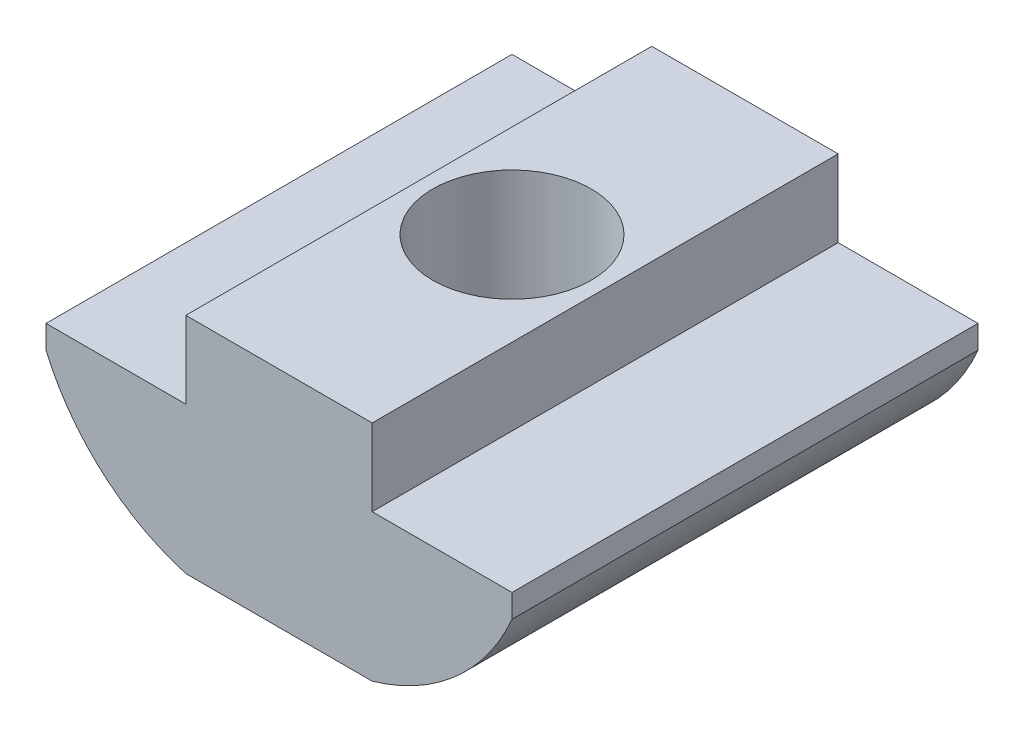
ISO-10303-21;
HEADER;
FILE_DESCRIPTION(('STEP AP214'),'2;1');
FILE_NAME('part.step','',(''),(''),'','','');
FILE_SCHEMA(('AUTOMOTIVE_DESIGN { 1 0 10303 214 1 1 1 1 }'));
ENDSEC;
DATA;
#1=APPLICATION_CONTEXT('core data for automotive mechanical design processes');
#2=APPLICATION_PROTOCOL_DEFINITION('international standard','automotive_design',2000,#1);
#3=PRODUCT_CONTEXT('',#1,'mechanical');
#4=PRODUCT('Part','Part','',(#3));
#5=PRODUCT_RELATED_PRODUCT_CATEGORY('part','',(#4));
#6=PRODUCT_DEFINITION_FORMATION('','',#4);
#7=PRODUCT_DEFINITION_CONTEXT('part definition',#1,'design');
#8=PRODUCT_DEFINITION('design','',#6,#7);
#9=PRODUCT_DEFINITION_SHAPE('','',#8);
#10=(LENGTH_UNIT() NAMED_UNIT(*) SI_UNIT(.MILLI.,.METRE.));
#11=(NAMED_UNIT(*) PLANE_ANGLE_UNIT() SI_UNIT($,.RADIAN.));
#12=(NAMED_UNIT(*) SI_UNIT($,.STERADIAN.) SOLID_ANGLE_UNIT());
#13=UNCERTAINTY_MEASURE_WITH_UNIT(LENGTH_MEASURE(1.E-05),#10,'distance_accuracy_value','');
#14=(GEOMETRIC_REPRESENTATION_CONTEXT(3) GLOBAL_UNCERTAINTY_ASSIGNED_CONTEXT((#13)) GLOBAL_UNIT_ASSIGNED_CONTEXT((#10,
#11,#12)) REPRESENTATION_CONTEXT('',''));
#15=CARTESIAN_POINT('',(0.,0.,0.));
#16=DIRECTION('',(0.,0.,1.));
#17=DIRECTION('',(1.,0.,0.));
#18=AXIS2_PLACEMENT_3D('',#15,#16,#17);
#19=CARTESIAN_POINT('',(1.37523414087264,-0.582340536837478,10.));
#20=DIRECTION('',(0.,0.,-1.));
#21=DIRECTION('',(-1.,0.,0.));
#22=AXIS2_PLACEMENT_3D('',#19,#20,#21);
#23=CYLINDRICAL_SURFACE('',#22,9.39188894785355);
#24=CARTESIAN_POINT('',(1.37523414087264,-0.582340536837478,-10.));
#25=DIRECTION('',(0.,0.,1.));
#26=DIRECTION('',(1.,0.,0.));
#27=AXIS2_PLACEMENT_3D('',#24,#25,#26);
#28=CIRCLE('',#27,9.39188894785355);
#29=CARTESIAN_POINT('',(4.00000000000091,-9.60000000000014,-10.));
#30=VERTEX_POINT('',#29);
#31=CARTESIAN_POINT('',(10.0000000000005,-4.2999999999995,-10.));
#32=VERTEX_POINT('',#31);
#33=EDGE_CURVE('E146',#30,#32,#28,.T.);
#34=ORIENTED_EDGE('',*,*,#33,.T.);
#35=DIRECTION('',(0.,0.,-1.));
#36=VECTOR('',#35,1.);
#37=CARTESIAN_POINT('',(10.0000000000005,-4.2999999999995,10.));
#38=LINE('',#37,#36);
#39=CARTESIAN_POINT('',(10.0000000000005,-4.2999999999995,10.));
#40=VERTEX_POINT('',#39);
#41=EDGE_CURVE('E11',#40,#32,#38,.T.);
#42=ORIENTED_EDGE('',*,*,#41,.F.);
#43=CARTESIAN_POINT('',(1.37523414087264,-0.582340536837478,10.));
#44=DIRECTION('',(0.,0.,1.));
#45=DIRECTION('',(1.,0.,0.));
#46=AXIS2_PLACEMENT_3D('',#43,#44,#45);
#47=CIRCLE('',#46,9.39188894785355);
#48=CARTESIAN_POINT('',(4.00000000000091,-9.60000000000014,10.));
#49=VERTEX_POINT('',#48);
#50=EDGE_CURVE('E165',#49,#40,#47,.T.);
#51=ORIENTED_EDGE('',*,*,#50,.F.);
#52=DIRECTION('',(0.,0.,-1.));
#53=VECTOR('',#52,1.);
#54=CARTESIAN_POINT('',(4.00000000000091,-9.60000000000014,10.));
#55=LINE('',#54,#53);
#56=EDGE_CURVE('E142',#49,#30,#55,.T.);
#57=ORIENTED_EDGE('',*,*,#56,.T.);
#58=EDGE_LOOP('',(#34,#42,#51,#57));
#59=FACE_BOUND('',#58,.T.);
#60=ADVANCED_FACE('F38',(#59),#23,.T.);
#61=CARTESIAN_POINT('',(10.,-3.30000000000007,10.));
#62=DIRECTION('',(-1.,-4.54497550706182E-13,0.));
#63=DIRECTION('',(4.54497550706182E-13,-1.,0.));
#64=AXIS2_PLACEMENT_3D('',#61,#62,#63);
#65=PLANE('',#64);
#66=DIRECTION('',(-4.54497550706182E-13,1.,0.));
#67=VECTOR('',#66,1.);
#68=CARTESIAN_POINT('',(10.,-3.30000000000007,-10.));
#69=LINE('',#68,#67);
#70=CARTESIAN_POINT('',(10.,-3.30000000000007,-10.));
#71=VERTEX_POINT('',#70);
#72=EDGE_CURVE('E149',#32,#71,#69,.T.);
#73=ORIENTED_EDGE('',*,*,#72,.T.);
#74=DIRECTION('',(0.,0.,-1.));
#75=VECTOR('',#74,1.);
#76=CARTESIAN_POINT('',(10.,-3.30000000000007,10.));
#77=LINE('',#76,#75);
#78=CARTESIAN_POINT('',(10.,-3.30000000000007,10.));
#79=VERTEX_POINT('',#78);
#80=EDGE_CURVE('E46',#79,#71,#77,.T.);
#81=ORIENTED_EDGE('',*,*,#80,.F.);
#82=DIRECTION('',(-4.54497550706182E-13,1.,0.));
#83=VECTOR('',#82,1.);
#84=CARTESIAN_POINT('',(10.,-3.30000000000007,10.));
#85=LINE('',#84,#83);
#86=EDGE_CURVE('E103',#40,#79,#85,.T.);
#87=ORIENTED_EDGE('',*,*,#86,.F.);
#88=ORIENTED_EDGE('',*,*,#41,.T.);
#89=EDGE_LOOP('',(#73,#81,#87,#88));
#90=FACE_BOUND('',#89,.T.);
#91=ADVANCED_FACE('F233',(#90),#65,.F.);
#92=CARTESIAN_POINT('',(10.,-3.30000000000007,10.));
#93=DIRECTION('',(0.,-1.,0.));
#94=DIRECTION('',(0.,0.,-1.));
#95=AXIS2_PLACEMENT_3D('',#92,#93,#94);
#96=PLANE('',#95);
#97=DIRECTION('',(-1.,0.,0.));
#98=VECTOR('',#97,1.);
#99=CARTESIAN_POINT('',(10.,-3.30000000000007,-10.));
#100=LINE('',#99,#98);
#101=CARTESIAN_POINT('',(4.,-3.30000000000007,-10.));
#102=VERTEX_POINT('',#101);
#103=EDGE_CURVE('E152',#71,#102,#100,.T.);
#104=ORIENTED_EDGE('',*,*,#103,.T.);
#105=DIRECTION('',(0.,0.,-1.));
#106=VECTOR('',#105,1.);
#107=CARTESIAN_POINT('',(4.,-3.30000000000007,10.));
#108=LINE('',#107,#106);
#109=CARTESIAN_POINT('',(4.,-3.30000000000007,10.));
#110=VERTEX_POINT('',#109);
#111=EDGE_CURVE('E178',#110,#102,#108,.T.);
#112=ORIENTED_EDGE('',*,*,#111,.F.);
#113=DIRECTION('',(-1.,0.,0.));
#114=VECTOR('',#113,1.);
#115=CARTESIAN_POINT('',(10.,-3.30000000000007,10.));
#116=LINE('',#115,#114);
#117=EDGE_CURVE('E186',#79,#110,#116,.T.);
#118=ORIENTED_EDGE('',*,*,#117,.F.);
#119=ORIENTED_EDGE('',*,*,#80,.T.);
#120=EDGE_LOOP('',(#104,#112,#118,#119));
#121=FACE_BOUND('',#120,.T.);
#122=ADVANCED_FACE('F184',(#121),#96,.F.);
#123=CARTESIAN_POINT('',(4.,-3.30000000000007,10.));
#124=DIRECTION('',(-1.,0.,0.));
#125=DIRECTION('',(0.,0.,1.));
#126=AXIS2_PLACEMENT_3D('',#123,#124,#125);
#127=PLANE('',#126);
#128=DIRECTION('',(0.,1.,0.));
#129=VECTOR('',#128,1.);
#130=CARTESIAN_POINT('',(4.,-3.30000000000007,-10.));
#131=LINE('',#130,#129);
#132=CARTESIAN_POINT('',(4.,0.,-10.));
#133=VERTEX_POINT('',#132);
#134=EDGE_CURVE('E154',#102,#133,#131,.T.);
#135=ORIENTED_EDGE('',*,*,#134,.T.);
#136=DIRECTION('',(0.,0.,-1.));
#137=VECTOR('',#136,1.);
#138=CARTESIAN_POINT('',(4.,0.,10.));
#139=LINE('',#138,#137);
#140=CARTESIAN_POINT('',(4.,0.,10.));
#141=VERTEX_POINT('',#140);
#142=EDGE_CURVE('E175',#141,#133,#139,.T.);
#143=ORIENTED_EDGE('',*,*,#142,.F.);
#144=DIRECTION('',(0.,1.,0.));
#145=VECTOR('',#144,1.);
#146=CARTESIAN_POINT('',(4.,-3.30000000000007,10.));
#147=LINE('',#146,#145);
#148=EDGE_CURVE('E204',#110,#141,#147,.T.);
#149=ORIENTED_EDGE('',*,*,#148,.F.);
#150=ORIENTED_EDGE('',*,*,#111,.T.);
#151=EDGE_LOOP('',(#135,#143,#149,#150));
#152=FACE_BOUND('',#151,.T.);
#153=ADVANCED_FACE('F195',(#152),#127,.F.);
#154=CARTESIAN_POINT('',(4.,0.,10.));
#155=DIRECTION('',(0.,-1.,0.));
#156=DIRECTION('',(0.,0.,-1.));
#157=AXIS2_PLACEMENT_3D('',#154,#155,#156);
#158=PLANE('',#157);
#159=CARTESIAN_POINT('',(0.,0.,0.));
#160=DIRECTION('',(0.,1.,0.));
#161=DIRECTION('',(0.,0.,1.));
#162=AXIS2_PLACEMENT_3D('',#159,#160,#161);
#163=CIRCLE('',#162,3.39999999999999);
#164=CARTESIAN_POINT('',(0.,0.,3.39999999999999));
#165=VERTEX_POINT('',#164);
#166=EDGE_CURVE('E214',#165,#165,#163,.T.);
#167=ORIENTED_EDGE('',*,*,#166,.F.);
#168=EDGE_LOOP('',(#167));
#169=FACE_BOUND('',#168,.T.);
#170=DIRECTION('',(-1.,0.,0.));
#171=VECTOR('',#170,1.);
#172=CARTESIAN_POINT('',(4.,0.,-10.));
#173=LINE('',#172,#171);
#174=CARTESIAN_POINT('',(-4.,0.,-10.));
#175=VERTEX_POINT('',#174);
#176=EDGE_CURVE('E156',#133,#175,#173,.T.);
#177=ORIENTED_EDGE('',*,*,#176,.T.);
#178=DIRECTION('',(0.,0.,-1.));
#179=VECTOR('',#178,1.);
#180=CARTESIAN_POINT('',(-4.,0.,10.));
#181=LINE('',#180,#179);
#182=CARTESIAN_POINT('',(-4.,0.,10.));
#183=VERTEX_POINT('',#182);
#184=EDGE_CURVE('E172',#183,#175,#181,.T.);
#185=ORIENTED_EDGE('',*,*,#184,.F.);
#186=DIRECTION('',(-1.,0.,0.));
#187=VECTOR('',#186,1.);
#188=CARTESIAN_POINT('',(4.,0.,10.));
#189=LINE('',#188,#187);
#190=EDGE_CURVE('E201',#141,#183,#189,.T.);
#191=ORIENTED_EDGE('',*,*,#190,.F.);
#192=ORIENTED_EDGE('',*,*,#142,.T.);
#193=EDGE_LOOP('',(#177,#185,#191,#192));
#194=FACE_BOUND('',#193,.T.);
#195=ADVANCED_FACE('F199',(#169,#194),#158,.F.);
#196=CARTESIAN_POINT('',(-4.,-3.30000000000007,10.));
#197=DIRECTION('',(1.,0.,0.));
#198=DIRECTION('',(0.,0.,-1.));
#199=AXIS2_PLACEMENT_3D('',#196,#197,#198);
#200=PLANE('',#199);
#201=DIRECTION('',(0.,-1.,0.));
#202=VECTOR('',#201,1.);
#203=CARTESIAN_POINT('',(-4.,-3.30000000000007,-10.));
#204=LINE('',#203,#202);
#205=CARTESIAN_POINT('',(-4.,-3.30000000000007,-10.));
#206=VERTEX_POINT('',#205);
#207=EDGE_CURVE('E158',#175,#206,#204,.T.);
#208=ORIENTED_EDGE('',*,*,#207,.T.);
#209=DIRECTION('',(0.,0.,-1.));
#210=VECTOR('',#209,1.);
#211=CARTESIAN_POINT('',(-4.,-3.30000000000007,10.));
#212=LINE('',#211,#210);
#213=CARTESIAN_POINT('',(-4.,-3.30000000000007,10.));
#214=VERTEX_POINT('',#213);
#215=EDGE_CURVE('E169',#214,#206,#212,.T.);
#216=ORIENTED_EDGE('',*,*,#215,.F.);
#217=DIRECTION('',(0.,-1.,0.));
#218=VECTOR('',#217,1.);
#219=CARTESIAN_POINT('',(-4.,-3.30000000000007,10.));
#220=LINE('',#219,#218);
#221=EDGE_CURVE('E203',#183,#214,#220,.T.);
#222=ORIENTED_EDGE('',*,*,#221,.F.);
#223=ORIENTED_EDGE('',*,*,#184,.T.);
#224=EDGE_LOOP('',(#208,#216,#222,#223));
#225=FACE_BOUND('',#224,.T.);
#226=ADVANCED_FACE('F222',(#225),#200,.F.);
#227=CARTESIAN_POINT('',(-4.,-3.30000000000007,10.));
#228=DIRECTION('',(0.,-1.,0.));
#229=DIRECTION('',(0.,0.,-1.));
#230=AXIS2_PLACEMENT_3D('',#227,#228,#229);
#231=PLANE('',#230);
#232=DIRECTION('',(-1.,0.,0.));
#233=VECTOR('',#232,1.);
#234=CARTESIAN_POINT('',(-4.,-3.30000000000007,-10.));
#235=LINE('',#234,#233);
#236=CARTESIAN_POINT('',(-10.,-3.30000000000007,-10.));
#237=VERTEX_POINT('',#236);
#238=EDGE_CURVE('E160',#206,#237,#235,.T.);
#239=ORIENTED_EDGE('',*,*,#238,.T.);
#240=DIRECTION('',(0.,0.,-1.));
#241=VECTOR('',#240,1.);
#242=CARTESIAN_POINT('',(-10.,-3.30000000000007,10.));
#243=LINE('',#242,#241);
#244=CARTESIAN_POINT('',(-10.,-3.30000000000007,10.));
#245=VERTEX_POINT('',#244);
#246=EDGE_CURVE('E137',#245,#237,#243,.T.);
#247=ORIENTED_EDGE('',*,*,#246,.F.);
#248=DIRECTION('',(-1.,0.,0.));
#249=VECTOR('',#248,1.);
#250=CARTESIAN_POINT('',(-4.,-3.30000000000007,10.));
#251=LINE('',#250,#249);
#252=EDGE_CURVE('E128',#214,#245,#251,.T.);
#253=ORIENTED_EDGE('',*,*,#252,.F.);
#254=ORIENTED_EDGE('',*,*,#215,.T.);
#255=EDGE_LOOP('',(#239,#247,#253,#254));
#256=FACE_BOUND('',#255,.T.);
#257=ADVANCED_FACE('F228',(#256),#231,.F.);
#258=CARTESIAN_POINT('',(-10.,-3.30000000000007,10.));
#259=DIRECTION('',(1.,0.,0.));
#260=DIRECTION('',(0.,0.,-1.));
#261=AXIS2_PLACEMENT_3D('',#258,#259,#260);
#262=PLANE('',#261);
#263=DIRECTION('',(0.,-1.,0.));
#264=VECTOR('',#263,1.);
#265=CARTESIAN_POINT('',(-10.,-3.30000000000007,-10.));
#266=LINE('',#265,#264);
#267=CARTESIAN_POINT('',(-10.,-4.30000000000019,-10.));
#268=VERTEX_POINT('',#267);
#269=EDGE_CURVE('E136',#237,#268,#266,.T.);
#270=ORIENTED_EDGE('',*,*,#269,.T.);
#271=DIRECTION('',(0.,0.,-1.));
#272=VECTOR('',#271,1.);
#273=CARTESIAN_POINT('',(-10.,-4.30000000000019,10.));
#274=LINE('',#273,#272);
#275=CARTESIAN_POINT('',(-10.,-4.30000000000019,10.));
#276=VERTEX_POINT('',#275);
#277=EDGE_CURVE('E133',#276,#268,#274,.T.);
#278=ORIENTED_EDGE('',*,*,#277,.F.);
#279=DIRECTION('',(0.,-1.,0.));
#280=VECTOR('',#279,1.);
#281=CARTESIAN_POINT('',(-10.,-3.30000000000007,10.));
#282=LINE('',#281,#280);
#283=EDGE_CURVE('E122',#245,#276,#282,.T.);
#284=ORIENTED_EDGE('',*,*,#283,.F.);
#285=ORIENTED_EDGE('',*,*,#246,.T.);
#286=EDGE_LOOP('',(#270,#278,#284,#285));
#287=FACE_BOUND('',#286,.T.);
#288=ADVANCED_FACE('F134',(#287),#262,.F.);
#289=CARTESIAN_POINT('',(-1.37523414087264,-0.582340536837478,10.));
#290=DIRECTION('',(0.,0.,-1.));
#291=DIRECTION('',(-1.,0.,0.));
#292=AXIS2_PLACEMENT_3D('',#289,#290,#291);
#293=CYLINDRICAL_SURFACE('',#292,9.39188894785349);
#294=CARTESIAN_POINT('',(-1.37523414087264,-0.582340536837478,-10.));
#295=DIRECTION('',(0.,0.,1.));
#296=DIRECTION('',(1.,0.,0.));
#297=AXIS2_PLACEMENT_3D('',#294,#295,#296);
#298=CIRCLE('',#297,9.39188894785349);
#299=CARTESIAN_POINT('',(-4.00000000000136,-9.60000000000002,-10.));
#300=VERTEX_POINT('',#299);
#301=EDGE_CURVE('E89',#268,#300,#298,.T.);
#302=ORIENTED_EDGE('',*,*,#301,.T.);
#303=DIRECTION('',(0.,0.,-1.));
#304=VECTOR('',#303,1.);
#305=CARTESIAN_POINT('',(-4.00000000000136,-9.60000000000002,10.));
#306=LINE('',#305,#304);
#307=CARTESIAN_POINT('',(-4.00000000000136,-9.60000000000002,10.));
#308=VERTEX_POINT('',#307);
#309=EDGE_CURVE('E138',#308,#300,#306,.T.);
#310=ORIENTED_EDGE('',*,*,#309,.F.);
#311=CARTESIAN_POINT('',(-1.37523414087264,-0.582340536837478,10.));
#312=DIRECTION('',(0.,0.,1.));
#313=DIRECTION('',(1.,0.,0.));
#314=AXIS2_PLACEMENT_3D('',#311,#312,#313);
#315=CIRCLE('',#314,9.39188894785349);
#316=EDGE_CURVE('E126',#276,#308,#315,.T.);
#317=ORIENTED_EDGE('',*,*,#316,.F.);
#318=ORIENTED_EDGE('',*,*,#277,.T.);
#319=EDGE_LOOP('',(#302,#310,#317,#318));
#320=FACE_BOUND('',#319,.T.);
#321=ADVANCED_FACE('F140',(#320),#293,.T.);
#322=CARTESIAN_POINT('',(4.00000000000091,-9.60000000000014,10.));
#323=DIRECTION('',(0.,1.,0.));
#324=DIRECTION('',(-1.,0.,0.));
#325=AXIS2_PLACEMENT_3D('',#322,#323,#324);
#326=PLANE('',#325);
#327=CARTESIAN_POINT('',(0.,-9.60000000000008,0.));
#328=DIRECTION('',(0.,1.,0.));
#329=DIRECTION('',(-1.,0.,0.));
#330=AXIS2_PLACEMENT_3D('',#327,#328,#329);
#331=CIRCLE('',#330,3.39999999999999);
#332=CARTESIAN_POINT('',(-3.39999999999999,-9.60000000000003,0.));
#333=VERTEX_POINT('',#332);
#334=EDGE_CURVE('E150',#333,#333,#331,.T.);
#335=ORIENTED_EDGE('',*,*,#334,.T.);
#336=EDGE_LOOP('',(#335));
#337=FACE_BOUND('',#336,.T.);
#338=DIRECTION('',(1.,0.,0.));
#339=VECTOR('',#338,1.);
#340=CARTESIAN_POINT('',(4.00000000000091,-9.60000000000014,-10.));
#341=LINE('',#340,#339);
#342=EDGE_CURVE('E95',#300,#30,#341,.T.);
#343=ORIENTED_EDGE('',*,*,#342,.T.);
#344=ORIENTED_EDGE('',*,*,#56,.F.);
#345=DIRECTION('',(1.,0.,0.));
#346=VECTOR('',#345,1.);
#347=CARTESIAN_POINT('',(4.00000000000091,-9.60000000000014,10.));
#348=LINE('',#347,#346);
#349=EDGE_CURVE('E54',#308,#49,#348,.T.);
#350=ORIENTED_EDGE('',*,*,#349,.F.);
#351=ORIENTED_EDGE('',*,*,#309,.T.);
#352=EDGE_LOOP('',(#343,#344,#350,#351));
#353=FACE_BOUND('',#352,.T.);
#354=ADVANCED_FACE('F252',(#337,#353),#326,.F.);
#355=CARTESIAN_POINT('',(1.37523414087264,-0.582340536837478,10.));
#356=DIRECTION('',(0.,0.,1.));
#357=DIRECTION('',(1.,0.,0.));
#358=AXIS2_PLACEMENT_3D('',#355,#356,#357);
#359=PLANE('',#358);
#360=ORIENTED_EDGE('',*,*,#50,.T.);
#361=ORIENTED_EDGE('',*,*,#86,.T.);
#362=ORIENTED_EDGE('',*,*,#117,.T.);
#363=ORIENTED_EDGE('',*,*,#148,.T.);
#364=ORIENTED_EDGE('',*,*,#190,.T.);
#365=ORIENTED_EDGE('',*,*,#221,.T.);
#366=ORIENTED_EDGE('',*,*,#252,.T.);
#367=ORIENTED_EDGE('',*,*,#283,.T.);
#368=ORIENTED_EDGE('',*,*,#316,.T.);
#369=ORIENTED_EDGE('',*,*,#349,.T.);
#370=EDGE_LOOP('',(#360,#361,#362,#363,#364,#365,#366,#367,#368,#369));
#371=FACE_BOUND('',#370,.T.);
#372=ADVANCED_FACE('F124',(#371),#359,.T.);
#373=CARTESIAN_POINT('',(1.37523414087264,-0.582340536837478,-10.));
#374=DIRECTION('',(0.,0.,1.));
#375=DIRECTION('',(1.,0.,0.));
#376=AXIS2_PLACEMENT_3D('',#373,#374,#375);
#377=PLANE('',#376);
#378=ORIENTED_EDGE('',*,*,#33,.F.);
#379=ORIENTED_EDGE('',*,*,#342,.F.);
#380=ORIENTED_EDGE('',*,*,#301,.F.);
#381=ORIENTED_EDGE('',*,*,#269,.F.);
#382=ORIENTED_EDGE('',*,*,#238,.F.);
#383=ORIENTED_EDGE('',*,*,#207,.F.);
#384=ORIENTED_EDGE('',*,*,#176,.F.);
#385=ORIENTED_EDGE('',*,*,#134,.F.);
#386=ORIENTED_EDGE('',*,*,#103,.F.);
#387=ORIENTED_EDGE('',*,*,#72,.F.);
#388=EDGE_LOOP('',(#378,#379,#380,#381,#382,#383,#384,#385,#386,#387));
#389=FACE_BOUND('',#388,.T.);
#390=ADVANCED_FACE('F190',(#389),#377,.F.);
#391=CARTESIAN_POINT('',(0.,0.,0.));
#392=DIRECTION('',(0.,1.,0.));
#393=DIRECTION('',(0.,0.,1.));
#394=AXIS2_PLACEMENT_3D('',#391,#392,#393);
#395=CYLINDRICAL_SURFACE('',#394,3.39999999999999);
#396=ORIENTED_EDGE('',*,*,#166,.T.);
#397=EDGE_LOOP('',(#396));
#398=FACE_BOUND('',#397,.T.);
#399=ORIENTED_EDGE('',*,*,#334,.F.);
#400=EDGE_LOOP('',(#399));
#401=FACE_BOUND('',#400,.T.);
#402=ADVANCED_FACE('F218',(#398,#401),#395,.F.);
#403=CLOSED_SHELL('',(#60,#91,#122,#153,#195,#226,#257,#288,#321,#354,#372,#390,#402));
#404=MANIFOLD_SOLID_BREP('B2',#403);
#405=ADVANCED_BREP_SHAPE_REPRESENTATION('',(#18,#404),#14);
#406=SHAPE_DEFINITION_REPRESENTATION(#9,#405);
ENDSEC;
END-ISO-10303-21;
